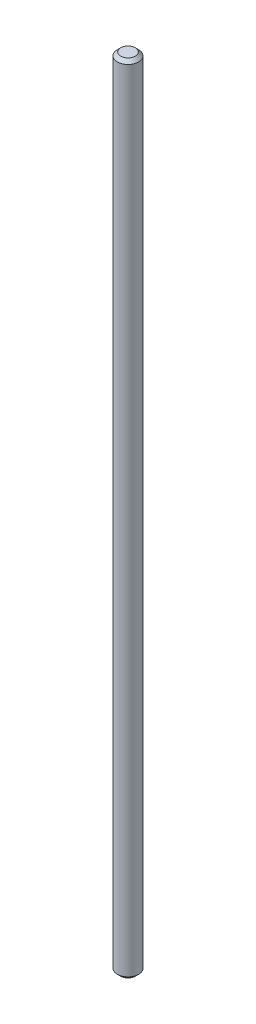
ISO-10303-21;
HEADER;
FILE_DESCRIPTION(('STEP AP214'),'2;1');
FILE_NAME('part.step','',(''),(''),'','','');
FILE_SCHEMA(('AUTOMOTIVE_DESIGN { 1 0 10303 214 1 1 1 1 }'));
ENDSEC;
DATA;
#1=APPLICATION_CONTEXT('core data for automotive mechanical design processes');
#2=APPLICATION_PROTOCOL_DEFINITION('international standard','automotive_design',2000,#1);
#3=PRODUCT_CONTEXT('',#1,'mechanical');
#4=PRODUCT('Part','Part','',(#3));
#5=PRODUCT_RELATED_PRODUCT_CATEGORY('part','',(#4));
#6=PRODUCT_DEFINITION_FORMATION('','',#4);
#7=PRODUCT_DEFINITION_CONTEXT('part definition',#1,'design');
#8=PRODUCT_DEFINITION('design','',#6,#7);
#9=PRODUCT_DEFINITION_SHAPE('','',#8);
#10=(LENGTH_UNIT() NAMED_UNIT(*) SI_UNIT(.MILLI.,.METRE.));
#11=(NAMED_UNIT(*) PLANE_ANGLE_UNIT() SI_UNIT($,.RADIAN.));
#12=(NAMED_UNIT(*) SI_UNIT($,.STERADIAN.) SOLID_ANGLE_UNIT());
#13=UNCERTAINTY_MEASURE_WITH_UNIT(LENGTH_MEASURE(1.E-05),#10,'distance_accuracy_value','');
#14=(GEOMETRIC_REPRESENTATION_CONTEXT(3) GLOBAL_UNCERTAINTY_ASSIGNED_CONTEXT((#13)) GLOBAL_UNIT_ASSIGNED_CONTEXT((#10,
#11,#12)) REPRESENTATION_CONTEXT('',''));
#15=CARTESIAN_POINT('',(0.,0.,0.));
#16=DIRECTION('',(0.,0.,1.));
#17=DIRECTION('',(1.,0.,0.));
#18=AXIS2_PLACEMENT_3D('',#15,#16,#17);
#19=CARTESIAN_POINT('',(0.,300.,0.));
#20=DIRECTION('',(0.,-1.,0.));
#21=DIRECTION('',(0.,0.,-1.));
#22=AXIS2_PLACEMENT_3D('',#19,#20,#21);
#23=CYLINDRICAL_SURFACE('',#22,4.);
#24=CARTESIAN_POINT('',(0.,1.25000000000003,0.));
#25=DIRECTION('',(0.,1.,0.));
#26=DIRECTION('',(0.,0.,1.));
#27=AXIS2_PLACEMENT_3D('',#24,#25,#26);
#28=CIRCLE('',#27,4.);
#29=CARTESIAN_POINT('',(0.,1.25000000000003,4.));
#30=VERTEX_POINT('',#29);
#31=EDGE_CURVE('E53',#30,#30,#28,.T.);
#32=ORIENTED_EDGE('',*,*,#31,.T.);
#33=EDGE_LOOP('',(#32));
#34=FACE_BOUND('',#33,.T.);
#35=CARTESIAN_POINT('',(0.,298.75,0.));
#36=DIRECTION('',(0.,1.,0.));
#37=DIRECTION('',(0.,0.,1.));
#38=AXIS2_PLACEMENT_3D('',#35,#36,#37);
#39=CIRCLE('',#38,4.);
#40=CARTESIAN_POINT('',(0.,298.75,4.));
#41=VERTEX_POINT('',#40);
#42=EDGE_CURVE('E58',#41,#41,#39,.F.);
#43=ORIENTED_EDGE('',*,*,#42,.T.);
#44=EDGE_LOOP('',(#43));
#45=FACE_BOUND('',#44,.T.);
#46=ADVANCED_FACE('F39',(#34,#45),#23,.T.);
#47=CARTESIAN_POINT('',(0.,300.,0.));
#48=DIRECTION('',(0.,1.,0.));
#49=DIRECTION('',(0.,0.,1.));
#50=AXIS2_PLACEMENT_3D('',#47,#48,#49);
#51=PLANE('',#50);
#52=CARTESIAN_POINT('',(0.,300.,0.));
#53=DIRECTION('',(0.,1.,0.));
#54=DIRECTION('',(0.,0.,1.));
#55=AXIS2_PLACEMENT_3D('',#52,#53,#54);
#56=CIRCLE('',#55,2.74999999999997);
#57=CARTESIAN_POINT('',(0.,300.,2.74999999999997));
#58=VERTEX_POINT('',#57);
#59=EDGE_CURVE('E10',#58,#58,#56,.T.);
#60=ORIENTED_EDGE('',*,*,#59,.T.);
#61=EDGE_LOOP('',(#60));
#62=FACE_BOUND('',#61,.T.);
#63=ADVANCED_FACE('F75',(#62),#51,.T.);
#64=CARTESIAN_POINT('',(0.,0.,0.));
#65=DIRECTION('',(0.,1.,0.));
#66=DIRECTION('',(0.,0.,1.));
#67=AXIS2_PLACEMENT_3D('',#64,#65,#66);
#68=PLANE('',#67);
#69=CARTESIAN_POINT('',(0.,0.,0.));
#70=DIRECTION('',(0.,1.,0.));
#71=DIRECTION('',(0.,0.,1.));
#72=AXIS2_PLACEMENT_3D('',#69,#70,#71);
#73=CIRCLE('',#72,2.74999999999997);
#74=CARTESIAN_POINT('',(0.,0.,2.74999999999997));
#75=VERTEX_POINT('',#74);
#76=EDGE_CURVE('E48',#75,#75,#73,.F.);
#77=ORIENTED_EDGE('',*,*,#76,.T.);
#78=EDGE_LOOP('',(#77));
#79=FACE_BOUND('',#78,.T.);
#80=ADVANCED_FACE('F72',(#79),#68,.F.);
#81=CARTESIAN_POINT('',(0.,1.25000000000003,0.));
#82=DIRECTION('',(0.,1.,0.));
#83=DIRECTION('',(0.,0.,1.));
#84=AXIS2_PLACEMENT_3D('',#81,#82,#83);
#85=CONICAL_SURFACE('',#84,4.,0.785398163397447);
#86=ORIENTED_EDGE('',*,*,#76,.F.);
#87=EDGE_LOOP('',(#86));
#88=FACE_BOUND('',#87,.T.);
#89=ORIENTED_EDGE('',*,*,#31,.F.);
#90=EDGE_LOOP('',(#89));
#91=FACE_BOUND('',#90,.T.);
#92=ADVANCED_FACE('F68',(#88,#91),#85,.T.);
#93=CARTESIAN_POINT('',(0.,300.,0.));
#94=DIRECTION('',(0.,-1.,0.));
#95=DIRECTION('',(0.,0.,-1.));
#96=AXIS2_PLACEMENT_3D('',#93,#94,#95);
#97=CONICAL_SURFACE('',#96,2.74999999999997,0.785398163397447);
#98=ORIENTED_EDGE('',*,*,#42,.F.);
#99=EDGE_LOOP('',(#98));
#100=FACE_BOUND('',#99,.T.);
#101=ORIENTED_EDGE('',*,*,#59,.F.);
#102=EDGE_LOOP('',(#101));
#103=FACE_BOUND('',#102,.T.);
#104=ADVANCED_FACE('F42',(#100,#103),#97,.T.);
#105=CLOSED_SHELL('',(#46,#63,#80,#92,#104));
#106=MANIFOLD_SOLID_BREP('B2',#105);
#107=ADVANCED_BREP_SHAPE_REPRESENTATION('',(#18,#106),#14);
#108=SHAPE_DEFINITION_REPRESENTATION(#9,#107);
ENDSEC;
END-ISO-10303-21;
